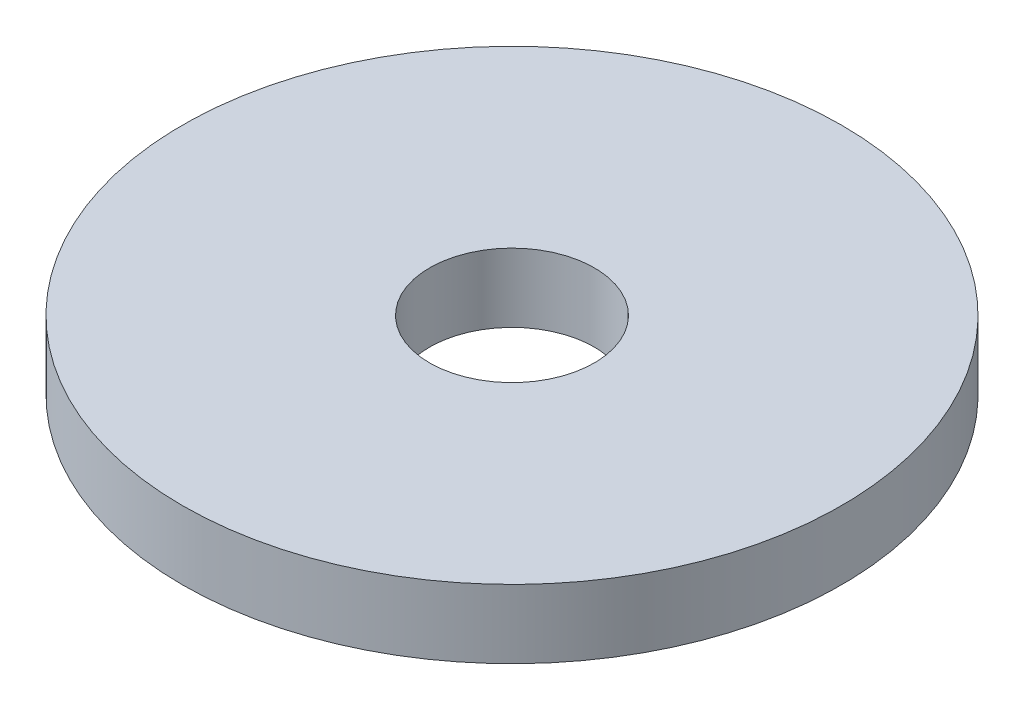
ISO-10303-21;
HEADER;
FILE_DESCRIPTION(('STEP AP214'),'2;1');
FILE_NAME('part.step','',(''),(''),'','','');
FILE_SCHEMA(('AUTOMOTIVE_DESIGN { 1 0 10303 214 1 1 1 1 }'));
ENDSEC;
DATA;
#1=APPLICATION_CONTEXT('core data for automotive mechanical design processes');
#2=APPLICATION_PROTOCOL_DEFINITION('international standard','automotive_design',2000,#1);
#3=PRODUCT_CONTEXT('',#1,'mechanical');
#4=PRODUCT('Part','Part','',(#3));
#5=PRODUCT_RELATED_PRODUCT_CATEGORY('part','',(#4));
#6=PRODUCT_DEFINITION_FORMATION('','',#4);
#7=PRODUCT_DEFINITION_CONTEXT('part definition',#1,'design');
#8=PRODUCT_DEFINITION('design','',#6,#7);
#9=PRODUCT_DEFINITION_SHAPE('','',#8);
#10=(LENGTH_UNIT() NAMED_UNIT(*) SI_UNIT(.MILLI.,.METRE.));
#11=(NAMED_UNIT(*) PLANE_ANGLE_UNIT() SI_UNIT($,.RADIAN.));
#12=(NAMED_UNIT(*) SI_UNIT($,.STERADIAN.) SOLID_ANGLE_UNIT());
#13=UNCERTAINTY_MEASURE_WITH_UNIT(LENGTH_MEASURE(1.E-05),#10,'distance_accuracy_value','');
#14=(GEOMETRIC_REPRESENTATION_CONTEXT(3) GLOBAL_UNCERTAINTY_ASSIGNED_CONTEXT((#13)) GLOBAL_UNIT_ASSIGNED_CONTEXT((#10,
#11,#12)) REPRESENTATION_CONTEXT('',''));
#15=CARTESIAN_POINT('',(0.,0.,0.));
#16=DIRECTION('',(0.,0.,1.));
#17=DIRECTION('',(1.,0.,0.));
#18=AXIS2_PLACEMENT_3D('',#15,#16,#17);
#19=CARTESIAN_POINT('',(0.,2.5,0.));
#20=DIRECTION('',(0.,-1.,0.));
#21=DIRECTION('',(0.,0.,-1.));
#22=AXIS2_PLACEMENT_3D('',#19,#20,#21);
#23=CYLINDRICAL_SURFACE('',#22,12.);
#24=CARTESIAN_POINT('',(0.,2.5,0.));
#25=DIRECTION('',(0.,1.,0.));
#26=DIRECTION('',(0.,0.,1.));
#27=AXIS2_PLACEMENT_3D('',#24,#25,#26);
#28=CIRCLE('',#27,12.);
#29=CARTESIAN_POINT('',(0.,2.5,12.));
#30=VERTEX_POINT('',#29);
#31=EDGE_CURVE('E10',#30,#30,#28,.T.);
#32=ORIENTED_EDGE('',*,*,#31,.F.);
#33=EDGE_LOOP('',(#32));
#34=FACE_BOUND('',#33,.T.);
#35=CARTESIAN_POINT('',(0.,0.,0.));
#36=DIRECTION('',(0.,1.,0.));
#37=DIRECTION('',(0.,0.,1.));
#38=AXIS2_PLACEMENT_3D('',#35,#36,#37);
#39=CIRCLE('',#38,12.);
#40=CARTESIAN_POINT('',(0.,0.,12.));
#41=VERTEX_POINT('',#40);
#42=EDGE_CURVE('E46',#41,#41,#39,.T.);
#43=ORIENTED_EDGE('',*,*,#42,.T.);
#44=EDGE_LOOP('',(#43));
#45=FACE_BOUND('',#44,.T.);
#46=ADVANCED_FACE('F43',(#34,#45),#23,.T.);
#47=CARTESIAN_POINT('',(0.,2.5,0.));
#48=DIRECTION('',(0.,1.,0.));
#49=DIRECTION('',(0.,0.,1.));
#50=AXIS2_PLACEMENT_3D('',#47,#48,#49);
#51=PLANE('',#50);
#52=CARTESIAN_POINT('',(0.,2.5,0.));
#53=DIRECTION('',(0.,1.,0.));
#54=DIRECTION('',(0.,0.,1.));
#55=AXIS2_PLACEMENT_3D('',#52,#53,#54);
#56=CIRCLE('',#55,3.);
#57=CARTESIAN_POINT('',(0.,2.5,3.));
#58=VERTEX_POINT('',#57);
#59=EDGE_CURVE('E57',#58,#58,#56,.T.);
#60=ORIENTED_EDGE('',*,*,#59,.F.);
#61=EDGE_LOOP('',(#60));
#62=FACE_BOUND('',#61,.T.);
#63=ORIENTED_EDGE('',*,*,#31,.T.);
#64=EDGE_LOOP('',(#63));
#65=FACE_BOUND('',#64,.T.);
#66=ADVANCED_FACE('F74',(#62,#65),#51,.T.);
#67=CARTESIAN_POINT('',(0.,0.,0.));
#68=DIRECTION('',(0.,1.,0.));
#69=DIRECTION('',(0.,0.,1.));
#70=AXIS2_PLACEMENT_3D('',#67,#68,#69);
#71=PLANE('',#70);
#72=CARTESIAN_POINT('',(0.,0.,0.));
#73=DIRECTION('',(0.,1.,0.));
#74=DIRECTION('',(0.,0.,1.));
#75=AXIS2_PLACEMENT_3D('',#72,#73,#74);
#76=CIRCLE('',#75,3.);
#77=CARTESIAN_POINT('',(0.,0.,3.));
#78=VERTEX_POINT('',#77);
#79=EDGE_CURVE('E55',#78,#78,#76,.T.);
#80=ORIENTED_EDGE('',*,*,#79,.T.);
#81=EDGE_LOOP('',(#80));
#82=FACE_BOUND('',#81,.T.);
#83=ORIENTED_EDGE('',*,*,#42,.F.);
#84=EDGE_LOOP('',(#83));
#85=FACE_BOUND('',#84,.T.);
#86=ADVANCED_FACE('F65',(#82,#85),#71,.F.);
#87=CARTESIAN_POINT('',(0.,0.,0.));
#88=DIRECTION('',(0.,1.,0.));
#89=DIRECTION('',(0.,0.,1.));
#90=AXIS2_PLACEMENT_3D('',#87,#88,#89);
#91=CYLINDRICAL_SURFACE('',#90,3.);
#92=ORIENTED_EDGE('',*,*,#79,.F.);
#93=EDGE_LOOP('',(#92));
#94=FACE_BOUND('',#93,.T.);
#95=ORIENTED_EDGE('',*,*,#59,.T.);
#96=EDGE_LOOP('',(#95));
#97=FACE_BOUND('',#96,.T.);
#98=ADVANCED_FACE('F68',(#94,#97),#91,.F.);
#99=CLOSED_SHELL('',(#46,#66,#86,#98));
#100=MANIFOLD_SOLID_BREP('B2',#99);
#101=ADVANCED_BREP_SHAPE_REPRESENTATION('',(#18,#100),#14);
#102=SHAPE_DEFINITION_REPRESENTATION(#9,#101);
ENDSEC;
END-ISO-10303-21;
